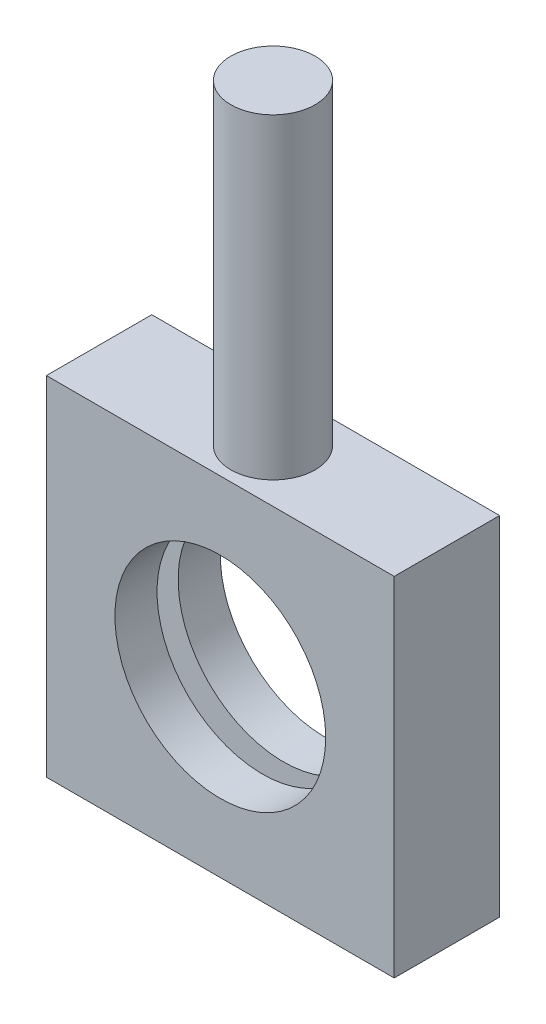
ISO-10303-21;
HEADER;
FILE_DESCRIPTION(('STEP AP214'),'2;1');
FILE_NAME('part.step','',(''),(''),'','','');
FILE_SCHEMA(('AUTOMOTIVE_DESIGN { 1 0 10303 214 1 1 1 1 }'));
ENDSEC;
DATA;
#1=APPLICATION_CONTEXT('core data for automotive mechanical design processes');
#2=APPLICATION_PROTOCOL_DEFINITION('international standard','automotive_design',2000,#1);
#3=PRODUCT_CONTEXT('',#1,'mechanical');
#4=PRODUCT('Part','Part','',(#3));
#5=PRODUCT_RELATED_PRODUCT_CATEGORY('part','',(#4));
#6=PRODUCT_DEFINITION_FORMATION('','',#4);
#7=PRODUCT_DEFINITION_CONTEXT('part definition',#1,'design');
#8=PRODUCT_DEFINITION('design','',#6,#7);
#9=PRODUCT_DEFINITION_SHAPE('','',#8);
#10=(LENGTH_UNIT() NAMED_UNIT(*) SI_UNIT(.MILLI.,.METRE.));
#11=(NAMED_UNIT(*) PLANE_ANGLE_UNIT() SI_UNIT($,.RADIAN.));
#12=(NAMED_UNIT(*) SI_UNIT($,.STERADIAN.) SOLID_ANGLE_UNIT());
#13=UNCERTAINTY_MEASURE_WITH_UNIT(LENGTH_MEASURE(1.E-05),#10,'distance_accuracy_value','');
#14=(GEOMETRIC_REPRESENTATION_CONTEXT(3) GLOBAL_UNCERTAINTY_ASSIGNED_CONTEXT((#13)) GLOBAL_UNIT_ASSIGNED_CONTEXT((#10,
#11,#12)) REPRESENTATION_CONTEXT('',''));
#15=CARTESIAN_POINT('',(0.,0.,0.));
#16=DIRECTION('',(0.,0.,1.));
#17=DIRECTION('',(1.,0.,0.));
#18=AXIS2_PLACEMENT_3D('',#15,#16,#17);
#19=CARTESIAN_POINT('',(-12.0364023210832,-11.9674081237911,10.));
#20=DIRECTION('',(0.,1.,0.));
#21=DIRECTION('',(0.,0.,1.));
#22=AXIS2_PLACEMENT_3D('',#19,#20,#21);
#23=PLANE('',#22);
#24=DIRECTION('',(1.,0.,0.));
#25=VECTOR('',#24,1.);
#26=CARTESIAN_POINT('',(-12.0364023210832,-11.9674081237911,0.));
#27=LINE('',#26,#25);
#28=CARTESIAN_POINT('',(-12.0364023210832,-11.9674081237911,0.));
#29=VERTEX_POINT('',#28);
#30=CARTESIAN_POINT('',(20.9635976789168,-11.9674081237911,0.));
#31=VERTEX_POINT('',#30);
#32=EDGE_CURVE('E165',#29,#31,#27,.T.);
#33=ORIENTED_EDGE('',*,*,#32,.T.);
#34=DIRECTION('',(0.,0.,-1.));
#35=VECTOR('',#34,1.);
#36=CARTESIAN_POINT('',(20.9635976789168,-11.9674081237911,10.));
#37=LINE('',#36,#35);
#38=CARTESIAN_POINT('',(20.9635976789168,-11.9674081237911,10.));
#39=VERTEX_POINT('',#38);
#40=EDGE_CURVE('E173',#39,#31,#37,.T.);
#41=ORIENTED_EDGE('',*,*,#40,.F.);
#42=DIRECTION('',(1.,0.,0.));
#43=VECTOR('',#42,1.);
#44=CARTESIAN_POINT('',(-12.0364023210832,-11.9674081237911,10.));
#45=LINE('',#44,#43);
#46=CARTESIAN_POINT('',(-12.0364023210832,-11.9674081237911,10.));
#47=VERTEX_POINT('',#46);
#48=EDGE_CURVE('E90',#47,#39,#45,.T.);
#49=ORIENTED_EDGE('',*,*,#48,.F.);
#50=DIRECTION('',(0.,0.,-1.));
#51=VECTOR('',#50,1.);
#52=CARTESIAN_POINT('',(-12.0364023210832,-11.9674081237911,10.));
#53=LINE('',#52,#51);
#54=EDGE_CURVE('E44',#47,#29,#53,.T.);
#55=ORIENTED_EDGE('',*,*,#54,.T.);
#56=EDGE_LOOP('',(#33,#41,#49,#55));
#57=FACE_BOUND('',#56,.T.);
#58=DIRECTION('',(1.,0.,0.));
#59=VECTOR('',#58,1.);
#60=CARTESIAN_POINT('',(-12.0364023210832,-11.9674081237911,4.));
#61=LINE('',#60,#59);
#62=CARTESIAN_POINT('',(-9.53640232108317,-11.9674081237911,4.));
#63=VERTEX_POINT('',#62);
#64=CARTESIAN_POINT('',(18.4635976789168,-11.9674081237911,4.));
#65=VERTEX_POINT('',#64);
#66=EDGE_CURVE('E134',#63,#65,#61,.T.);
#67=ORIENTED_EDGE('',*,*,#66,.F.);
#68=DIRECTION('',(0.,0.,-1.));
#69=VECTOR('',#68,1.);
#70=CARTESIAN_POINT('',(-9.53640232108317,-11.9674081237911,10.));
#71=LINE('',#70,#69);
#72=CARTESIAN_POINT('',(-9.53640232108317,-11.9674081237911,6.));
#73=VERTEX_POINT('',#72);
#74=EDGE_CURVE('E133',#73,#63,#71,.T.);
#75=ORIENTED_EDGE('',*,*,#74,.F.);
#76=DIRECTION('',(1.,0.,0.));
#77=VECTOR('',#76,1.);
#78=CARTESIAN_POINT('',(-12.0364023210832,-11.9674081237911,6.));
#79=LINE('',#78,#77);
#80=CARTESIAN_POINT('',(18.4635976789168,-11.9674081237911,6.));
#81=VERTEX_POINT('',#80);
#82=EDGE_CURVE('E142',#73,#81,#79,.T.);
#83=ORIENTED_EDGE('',*,*,#82,.T.);
#84=DIRECTION('',(0.,0.,-1.));
#85=VECTOR('',#84,1.);
#86=CARTESIAN_POINT('',(18.4635976789168,-11.9674081237911,10.));
#87=LINE('',#86,#85);
#88=EDGE_CURVE('E147',#81,#65,#87,.T.);
#89=ORIENTED_EDGE('',*,*,#88,.T.);
#90=EDGE_LOOP('',(#67,#75,#83,#89));
#91=FACE_BOUND('',#90,.T.);
#92=ADVANCED_FACE('F35',(#57,#91),#23,.F.);
#93=CARTESIAN_POINT('',(-12.0364023210832,21.0325918762089,10.));
#94=DIRECTION('',(1.,0.,0.));
#95=DIRECTION('',(0.,1.,0.));
#96=AXIS2_PLACEMENT_3D('',#93,#94,#95);
#97=PLANE('',#96);
#98=DIRECTION('',(0.,-1.,0.));
#99=VECTOR('',#98,1.);
#100=CARTESIAN_POINT('',(-12.0364023210832,21.0325918762089,0.));
#101=LINE('',#100,#99);
#102=CARTESIAN_POINT('',(-12.0364023210832,21.0325918762089,0.));
#103=VERTEX_POINT('',#102);
#104=EDGE_CURVE('E150',#103,#29,#101,.T.);
#105=ORIENTED_EDGE('',*,*,#104,.T.);
#106=ORIENTED_EDGE('',*,*,#54,.F.);
#107=DIRECTION('',(0.,-1.,0.));
#108=VECTOR('',#107,1.);
#109=CARTESIAN_POINT('',(-12.0364023210832,21.0325918762089,10.));
#110=LINE('',#109,#108);
#111=CARTESIAN_POINT('',(-12.0364023210832,21.0325918762089,10.));
#112=VERTEX_POINT('',#111);
#113=EDGE_CURVE('E156',#112,#47,#110,.T.);
#114=ORIENTED_EDGE('',*,*,#113,.F.);
#115=DIRECTION('',(0.,0.,-1.));
#116=VECTOR('',#115,1.);
#117=CARTESIAN_POINT('',(-12.0364023210832,21.0325918762089,10.));
#118=LINE('',#117,#116);
#119=EDGE_CURVE('E162',#112,#103,#118,.T.);
#120=ORIENTED_EDGE('',*,*,#119,.T.);
#121=EDGE_LOOP('',(#105,#106,#114,#120));
#122=FACE_BOUND('',#121,.T.);
#123=ADVANCED_FACE('F37',(#122),#97,.F.);
#124=CARTESIAN_POINT('',(20.9635976789168,21.0325918762089,10.));
#125=DIRECTION('',(-1.,0.,0.));
#126=DIRECTION('',(0.,0.,1.));
#127=AXIS2_PLACEMENT_3D('',#124,#125,#126);
#128=PLANE('',#127);
#129=DIRECTION('',(0.,1.,0.));
#130=VECTOR('',#129,1.);
#131=CARTESIAN_POINT('',(20.9635976789168,21.0325918762089,0.));
#132=LINE('',#131,#130);
#133=CARTESIAN_POINT('',(20.9635976789168,21.0325918762089,0.));
#134=VERTEX_POINT('',#133);
#135=EDGE_CURVE('E167',#31,#134,#132,.T.);
#136=ORIENTED_EDGE('',*,*,#135,.T.);
#137=DIRECTION('',(0.,0.,-1.));
#138=VECTOR('',#137,1.);
#139=CARTESIAN_POINT('',(20.9635976789168,21.0325918762089,10.));
#140=LINE('',#139,#138);
#141=CARTESIAN_POINT('',(20.9635976789168,21.0325918762089,10.));
#142=VERTEX_POINT('',#141);
#143=EDGE_CURVE('E171',#142,#134,#140,.T.);
#144=ORIENTED_EDGE('',*,*,#143,.F.);
#145=DIRECTION('',(0.,1.,0.));
#146=VECTOR('',#145,1.);
#147=CARTESIAN_POINT('',(20.9635976789168,21.0325918762089,10.));
#148=LINE('',#147,#146);
#149=EDGE_CURVE('E159',#39,#142,#148,.T.);
#150=ORIENTED_EDGE('',*,*,#149,.F.);
#151=ORIENTED_EDGE('',*,*,#40,.T.);
#152=EDGE_LOOP('',(#136,#144,#150,#151));
#153=FACE_BOUND('',#152,.T.);
#154=ADVANCED_FACE('F185',(#153),#128,.F.);
#155=CARTESIAN_POINT('',(-12.0364023210832,21.0325918762089,10.));
#156=DIRECTION('',(0.,-1.,0.));
#157=DIRECTION('',(0.,0.,-1.));
#158=AXIS2_PLACEMENT_3D('',#155,#156,#157);
#159=PLANE('',#158);
#160=CARTESIAN_POINT('',(4.46359767891683,21.0325918762089,5.));
#161=DIRECTION('',(0.,1.,0.));
#162=DIRECTION('',(0.,0.,1.));
#163=AXIS2_PLACEMENT_3D('',#160,#161,#162);
#164=CIRCLE('',#163,4.);
#165=CARTESIAN_POINT('',(4.46359767891683,21.0325918762089,9.));
#166=VERTEX_POINT('',#165);
#167=EDGE_CURVE('E11',#166,#166,#164,.T.);
#168=ORIENTED_EDGE('',*,*,#167,.F.);
#169=EDGE_LOOP('',(#168));
#170=FACE_BOUND('',#169,.T.);
#171=DIRECTION('',(-1.,0.,0.));
#172=VECTOR('',#171,1.);
#173=CARTESIAN_POINT('',(-12.0364023210832,21.0325918762089,0.));
#174=LINE('',#173,#172);
#175=EDGE_CURVE('E82',#134,#103,#174,.T.);
#176=ORIENTED_EDGE('',*,*,#175,.T.);
#177=ORIENTED_EDGE('',*,*,#119,.F.);
#178=DIRECTION('',(-1.,0.,0.));
#179=VECTOR('',#178,1.);
#180=CARTESIAN_POINT('',(-12.0364023210832,21.0325918762089,10.));
#181=LINE('',#180,#179);
#182=EDGE_CURVE('E61',#142,#112,#181,.T.);
#183=ORIENTED_EDGE('',*,*,#182,.F.);
#184=ORIENTED_EDGE('',*,*,#143,.T.);
#185=EDGE_LOOP('',(#176,#177,#183,#184));
#186=FACE_BOUND('',#185,.T.);
#187=ADVANCED_FACE('F187',(#170,#186),#159,.F.);
#188=CARTESIAN_POINT('',(0.,0.,10.));
#189=DIRECTION('',(0.,0.,1.));
#190=DIRECTION('',(1.,0.,0.));
#191=AXIS2_PLACEMENT_3D('',#188,#189,#190);
#192=PLANE('',#191);
#193=CARTESIAN_POINT('',(4.46359767891683,4.5325918762089,10.));
#194=DIRECTION('',(0.,0.,1.));
#195=DIRECTION('',(1.,0.,0.));
#196=AXIS2_PLACEMENT_3D('',#193,#194,#195);
#197=CIRCLE('',#196,10.);
#198=CARTESIAN_POINT('',(14.4635976789168,4.5325918762089,10.));
#199=VERTEX_POINT('',#198);
#200=EDGE_CURVE('E343',#199,#199,#197,.T.);
#201=ORIENTED_EDGE('',*,*,#200,.F.);
#202=EDGE_LOOP('',(#201));
#203=FACE_BOUND('',#202,.T.);
#204=ORIENTED_EDGE('',*,*,#113,.T.);
#205=ORIENTED_EDGE('',*,*,#48,.T.);
#206=ORIENTED_EDGE('',*,*,#149,.T.);
#207=ORIENTED_EDGE('',*,*,#182,.T.);
#208=EDGE_LOOP('',(#204,#205,#206,#207));
#209=FACE_BOUND('',#208,.T.);
#210=ADVANCED_FACE('F188',(#203,#209),#192,.T.);
#211=CARTESIAN_POINT('',(0.,0.,0.));
#212=DIRECTION('',(0.,0.,1.));
#213=DIRECTION('',(1.,0.,0.));
#214=AXIS2_PLACEMENT_3D('',#211,#212,#213);
#215=PLANE('',#214);
#216=CARTESIAN_POINT('',(4.46359767891683,4.5325918762089,0.));
#217=DIRECTION('',(0.,0.,1.));
#218=DIRECTION('',(1.,0.,0.));
#219=AXIS2_PLACEMENT_3D('',#216,#217,#218);
#220=CIRCLE('',#219,10.);
#221=CARTESIAN_POINT('',(14.4635976789168,4.5325918762089,0.));
#222=VERTEX_POINT('',#221);
#223=EDGE_CURVE('E346',#222,#222,#220,.T.);
#224=ORIENTED_EDGE('',*,*,#223,.T.);
#225=EDGE_LOOP('',(#224));
#226=FACE_BOUND('',#225,.T.);
#227=ORIENTED_EDGE('',*,*,#104,.F.);
#228=ORIENTED_EDGE('',*,*,#175,.F.);
#229=ORIENTED_EDGE('',*,*,#135,.F.);
#230=ORIENTED_EDGE('',*,*,#32,.F.);
#231=EDGE_LOOP('',(#227,#228,#229,#230));
#232=FACE_BOUND('',#231,.T.);
#233=ADVANCED_FACE('F181',(#226,#232),#215,.F.);
#234=CARTESIAN_POINT('',(-9.53640232108317,21.0325918762089,10.));
#235=DIRECTION('',(1.,0.,0.));
#236=DIRECTION('',(0.,1.,0.));
#237=AXIS2_PLACEMENT_3D('',#234,#235,#236);
#238=PLANE('',#237);
#239=DIRECTION('',(0.,-1.,0.));
#240=VECTOR('',#239,1.);
#241=CARTESIAN_POINT('',(-9.53640232108317,21.0325918762089,4.));
#242=LINE('',#241,#240);
#243=CARTESIAN_POINT('',(-9.53640232108317,17.0325918762089,4.));
#244=VERTEX_POINT('',#243);
#245=EDGE_CURVE('E117',#244,#63,#242,.T.);
#246=ORIENTED_EDGE('',*,*,#245,.F.);
#247=DIRECTION('',(0.,0.,-1.));
#248=VECTOR('',#247,1.);
#249=CARTESIAN_POINT('',(-9.53640232108317,17.0325918762089,10.));
#250=LINE('',#249,#248);
#251=CARTESIAN_POINT('',(-9.53640232108317,17.0325918762089,6.));
#252=VERTEX_POINT('',#251);
#253=EDGE_CURVE('E125',#252,#244,#250,.T.);
#254=ORIENTED_EDGE('',*,*,#253,.F.);
#255=DIRECTION('',(0.,-1.,0.));
#256=VECTOR('',#255,1.);
#257=CARTESIAN_POINT('',(-9.53640232108317,21.0325918762089,6.));
#258=LINE('',#257,#256);
#259=EDGE_CURVE('E52',#252,#73,#258,.T.);
#260=ORIENTED_EDGE('',*,*,#259,.T.);
#261=ORIENTED_EDGE('',*,*,#74,.T.);
#262=EDGE_LOOP('',(#246,#254,#260,#261));
#263=FACE_BOUND('',#262,.T.);
#264=ADVANCED_FACE('F131',(#263),#238,.T.);
#265=CARTESIAN_POINT('',(18.4635976789168,21.0325918762089,10.));
#266=DIRECTION('',(-1.,0.,0.));
#267=DIRECTION('',(0.,0.,1.));
#268=AXIS2_PLACEMENT_3D('',#265,#266,#267);
#269=PLANE('',#268);
#270=DIRECTION('',(0.,1.,0.));
#271=VECTOR('',#270,1.);
#272=CARTESIAN_POINT('',(18.4635976789168,21.0325918762089,4.));
#273=LINE('',#272,#271);
#274=CARTESIAN_POINT('',(18.4635976789168,17.0325918762089,4.));
#275=VERTEX_POINT('',#274);
#276=EDGE_CURVE('E120',#65,#275,#273,.T.);
#277=ORIENTED_EDGE('',*,*,#276,.F.);
#278=ORIENTED_EDGE('',*,*,#88,.F.);
#279=DIRECTION('',(0.,1.,0.));
#280=VECTOR('',#279,1.);
#281=CARTESIAN_POINT('',(18.4635976789168,21.0325918762089,6.));
#282=LINE('',#281,#280);
#283=CARTESIAN_POINT('',(18.4635976789168,17.0325918762089,6.));
#284=VERTEX_POINT('',#283);
#285=EDGE_CURVE('E145',#81,#284,#282,.T.);
#286=ORIENTED_EDGE('',*,*,#285,.T.);
#287=DIRECTION('',(0.,0.,-1.));
#288=VECTOR('',#287,1.);
#289=CARTESIAN_POINT('',(18.4635976789168,17.0325918762089,10.));
#290=LINE('',#289,#288);
#291=EDGE_CURVE('E129',#284,#275,#290,.T.);
#292=ORIENTED_EDGE('',*,*,#291,.T.);
#293=EDGE_LOOP('',(#277,#278,#286,#292));
#294=FACE_BOUND('',#293,.T.);
#295=ADVANCED_FACE('F237',(#294),#269,.T.);
#296=CARTESIAN_POINT('',(-12.0364023210832,17.0325918762089,10.));
#297=DIRECTION('',(0.,-1.,0.));
#298=DIRECTION('',(0.,0.,-1.));
#299=AXIS2_PLACEMENT_3D('',#296,#297,#298);
#300=PLANE('',#299);
#301=DIRECTION('',(-1.,0.,0.));
#302=VECTOR('',#301,1.);
#303=CARTESIAN_POINT('',(-12.0364023210832,17.0325918762089,4.));
#304=LINE('',#303,#302);
#305=EDGE_CURVE('E113',#275,#244,#304,.T.);
#306=ORIENTED_EDGE('',*,*,#305,.F.);
#307=ORIENTED_EDGE('',*,*,#291,.F.);
#308=DIRECTION('',(-1.,0.,0.));
#309=VECTOR('',#308,1.);
#310=CARTESIAN_POINT('',(-12.0364023210832,17.0325918762089,6.));
#311=LINE('',#310,#309);
#312=EDGE_CURVE('E128',#284,#252,#311,.T.);
#313=ORIENTED_EDGE('',*,*,#312,.T.);
#314=ORIENTED_EDGE('',*,*,#253,.T.);
#315=EDGE_LOOP('',(#306,#307,#313,#314));
#316=FACE_BOUND('',#315,.T.);
#317=ADVANCED_FACE('F126',(#316),#300,.T.);
#318=CARTESIAN_POINT('',(0.,0.,6.));
#319=DIRECTION('',(0.,0.,1.));
#320=DIRECTION('',(1.,0.,0.));
#321=AXIS2_PLACEMENT_3D('',#318,#319,#320);
#322=PLANE('',#321);
#323=CARTESIAN_POINT('',(4.46359767891683,4.5325918762089,6.));
#324=DIRECTION('',(0.,0.,1.));
#325=DIRECTION('',(1.,0.,0.));
#326=AXIS2_PLACEMENT_3D('',#323,#324,#325);
#327=CIRCLE('',#326,10.);
#328=CARTESIAN_POINT('',(14.4635976789168,4.5325918762089,6.));
#329=VERTEX_POINT('',#328);
#330=EDGE_CURVE('E135',#329,#329,#327,.T.);
#331=ORIENTED_EDGE('',*,*,#330,.T.);
#332=EDGE_LOOP('',(#331));
#333=FACE_BOUND('',#332,.T.);
#334=ORIENTED_EDGE('',*,*,#259,.F.);
#335=ORIENTED_EDGE('',*,*,#312,.F.);
#336=ORIENTED_EDGE('',*,*,#285,.F.);
#337=ORIENTED_EDGE('',*,*,#82,.F.);
#338=EDGE_LOOP('',(#334,#335,#336,#337));
#339=FACE_BOUND('',#338,.T.);
#340=ADVANCED_FACE('F236',(#333,#339),#322,.F.);
#341=CARTESIAN_POINT('',(0.,0.,4.));
#342=DIRECTION('',(0.,0.,1.));
#343=DIRECTION('',(1.,0.,0.));
#344=AXIS2_PLACEMENT_3D('',#341,#342,#343);
#345=PLANE('',#344);
#346=CARTESIAN_POINT('',(4.46359767891683,4.5325918762089,4.));
#347=DIRECTION('',(0.,0.,1.));
#348=DIRECTION('',(1.,0.,0.));
#349=AXIS2_PLACEMENT_3D('',#346,#347,#348);
#350=CIRCLE('',#349,10.);
#351=CARTESIAN_POINT('',(14.4635976789168,4.5325918762089,4.));
#352=VERTEX_POINT('',#351);
#353=EDGE_CURVE('E39',#352,#352,#350,.T.);
#354=ORIENTED_EDGE('',*,*,#353,.F.);
#355=EDGE_LOOP('',(#354));
#356=FACE_BOUND('',#355,.T.);
#357=ORIENTED_EDGE('',*,*,#245,.T.);
#358=ORIENTED_EDGE('',*,*,#66,.T.);
#359=ORIENTED_EDGE('',*,*,#276,.T.);
#360=ORIENTED_EDGE('',*,*,#305,.T.);
#361=EDGE_LOOP('',(#357,#358,#359,#360));
#362=FACE_BOUND('',#361,.T.);
#363=ADVANCED_FACE('F115',(#356,#362),#345,.T.);
#364=CARTESIAN_POINT('',(4.46359767891683,4.5325918762089,0.));
#365=DIRECTION('',(0.,0.,1.));
#366=DIRECTION('',(1.,0.,0.));
#367=AXIS2_PLACEMENT_3D('',#364,#365,#366);
#368=CYLINDRICAL_SURFACE('',#367,10.);
#369=ORIENTED_EDGE('',*,*,#353,.T.);
#370=EDGE_LOOP('',(#369));
#371=FACE_BOUND('',#370,.T.);
#372=ORIENTED_EDGE('',*,*,#223,.F.);
#373=EDGE_LOOP('',(#372));
#374=FACE_BOUND('',#373,.T.);
#375=ADVANCED_FACE('F300',(#371,#374),#368,.F.);
#376=ORIENTED_EDGE('',*,*,#200,.T.);
#377=EDGE_LOOP('',(#376));
#378=FACE_BOUND('',#377,.T.);
#379=ORIENTED_EDGE('',*,*,#330,.F.);
#380=EDGE_LOOP('',(#379));
#381=FACE_BOUND('',#380,.T.);
#382=ADVANCED_FACE('F308',(#378,#381),#368,.F.);
#383=CARTESIAN_POINT('',(4.46359767891683,51.0325918762089,5.));
#384=DIRECTION('',(0.,-1.,0.));
#385=DIRECTION('',(0.,0.,-1.));
#386=AXIS2_PLACEMENT_3D('',#383,#384,#385);
#387=CYLINDRICAL_SURFACE('',#386,4.);
#388=CARTESIAN_POINT('',(4.46359767891683,51.0325918762089,5.));
#389=DIRECTION('',(0.,1.,0.));
#390=DIRECTION('',(0.,0.,1.));
#391=AXIS2_PLACEMENT_3D('',#388,#389,#390);
#392=CIRCLE('',#391,4.);
#393=CARTESIAN_POINT('',(4.46359767891683,51.0325918762089,9.));
#394=VERTEX_POINT('',#393);
#395=EDGE_CURVE('E342',#394,#394,#392,.T.);
#396=ORIENTED_EDGE('',*,*,#395,.F.);
#397=EDGE_LOOP('',(#396));
#398=FACE_BOUND('',#397,.T.);
#399=ORIENTED_EDGE('',*,*,#167,.T.);
#400=EDGE_LOOP('',(#399));
#401=FACE_BOUND('',#400,.T.);
#402=ADVANCED_FACE('F316',(#398,#401),#387,.T.);
#403=CARTESIAN_POINT('',(4.46359767891683,51.0325918762089,5.));
#404=DIRECTION('',(0.,1.,0.));
#405=DIRECTION('',(0.,0.,1.));
#406=AXIS2_PLACEMENT_3D('',#403,#404,#405);
#407=PLANE('',#406);
#408=ORIENTED_EDGE('',*,*,#395,.T.);
#409=EDGE_LOOP('',(#408));
#410=FACE_BOUND('',#409,.T.);
#411=ADVANCED_FACE('F323',(#410),#407,.T.);
#412=CLOSED_SHELL('',(#92,#123,#154,#187,#210,#233,#264,#295,#317,#340,#363,#375,#382,#402,#411));
#413=MANIFOLD_SOLID_BREP('B2',#412);
#414=ADVANCED_BREP_SHAPE_REPRESENTATION('',(#18,#413),#14);
#415=SHAPE_DEFINITION_REPRESENTATION(#9,#414);
ENDSEC;
END-ISO-10303-21;
